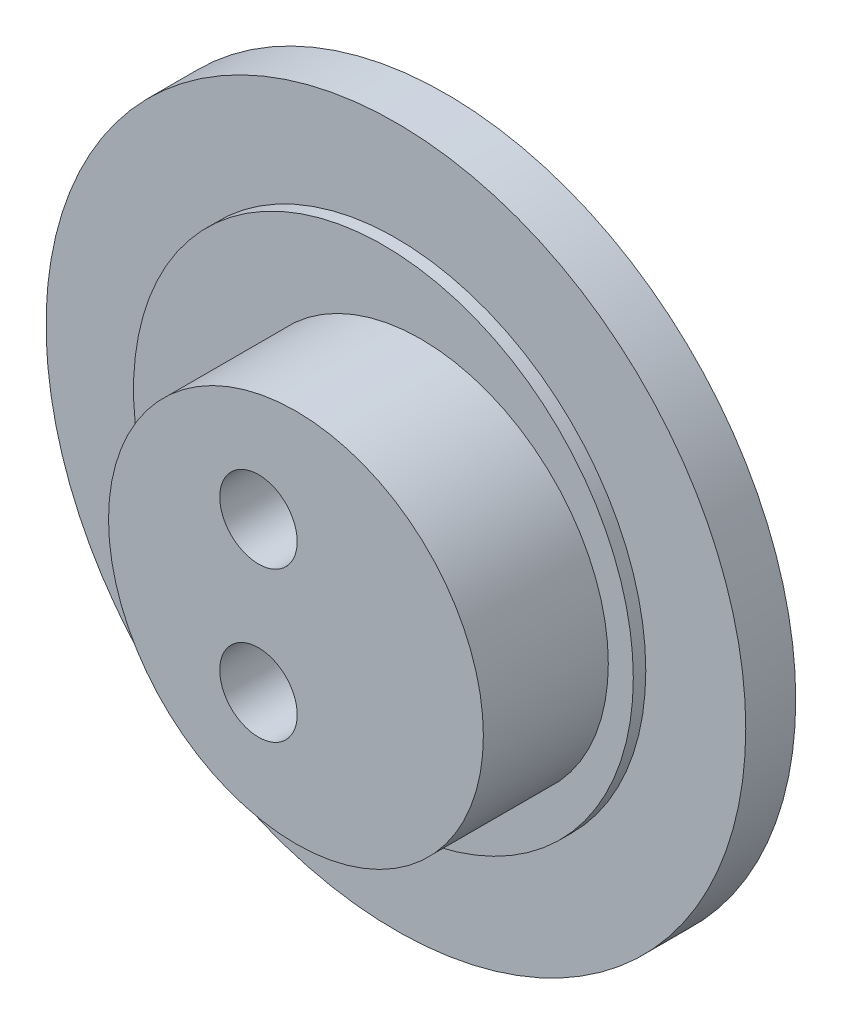
ISO-10303-21;
HEADER;
FILE_DESCRIPTION(('STEP AP214'),'2;1');
FILE_NAME('part.step','',(''),(''),'','','');
FILE_SCHEMA(('AUTOMOTIVE_DESIGN { 1 0 10303 214 1 1 1 1 }'));
ENDSEC;
DATA;
#1=APPLICATION_CONTEXT('core data for automotive mechanical design processes');
#2=APPLICATION_PROTOCOL_DEFINITION('international standard','automotive_design',2000,#1);
#3=PRODUCT_CONTEXT('',#1,'mechanical');
#4=PRODUCT('Part','Part','',(#3));
#5=PRODUCT_RELATED_PRODUCT_CATEGORY('part','',(#4));
#6=PRODUCT_DEFINITION_FORMATION('','',#4);
#7=PRODUCT_DEFINITION_CONTEXT('part definition',#1,'design');
#8=PRODUCT_DEFINITION('design','',#6,#7);
#9=PRODUCT_DEFINITION_SHAPE('','',#8);
#10=(LENGTH_UNIT() NAMED_UNIT(*) SI_UNIT(.MILLI.,.METRE.));
#11=(NAMED_UNIT(*) PLANE_ANGLE_UNIT() SI_UNIT($,.RADIAN.));
#12=(NAMED_UNIT(*) SI_UNIT($,.STERADIAN.) SOLID_ANGLE_UNIT());
#13=UNCERTAINTY_MEASURE_WITH_UNIT(LENGTH_MEASURE(1.E-05),#10,'distance_accuracy_value','');
#14=(GEOMETRIC_REPRESENTATION_CONTEXT(3) GLOBAL_UNCERTAINTY_ASSIGNED_CONTEXT((#13)) GLOBAL_UNIT_ASSIGNED_CONTEXT((#10,
#11,#12)) REPRESENTATION_CONTEXT('',''));
#15=CARTESIAN_POINT('',(0.,0.,0.));
#16=DIRECTION('',(0.,0.,1.));
#17=DIRECTION('',(1.,0.,0.));
#18=AXIS2_PLACEMENT_3D('',#15,#16,#17);
#19=CARTESIAN_POINT('',(0.,0.,0.5));
#20=DIRECTION('',(0.,0.,-1.));
#21=DIRECTION('',(-1.,0.,0.));
#22=AXIS2_PLACEMENT_3D('',#19,#20,#21);
#23=CYLINDRICAL_SURFACE('',#22,10.);
#24=CARTESIAN_POINT('',(0.,0.,0.5));
#25=DIRECTION('',(0.,0.,1.));
#26=DIRECTION('',(1.,0.,0.));
#27=AXIS2_PLACEMENT_3D('',#24,#25,#26);
#28=CIRCLE('',#27,10.);
#29=CARTESIAN_POINT('',(10.,0.,0.5));
#30=VERTEX_POINT('',#29);
#31=EDGE_CURVE('E51',#30,#30,#28,.T.);
#32=ORIENTED_EDGE('',*,*,#31,.F.);
#33=EDGE_LOOP('',(#32));
#34=FACE_BOUND('',#33,.T.);
#35=CARTESIAN_POINT('',(0.,0.,0.));
#36=DIRECTION('',(0.,0.,1.));
#37=DIRECTION('',(1.,0.,0.));
#38=AXIS2_PLACEMENT_3D('',#35,#36,#37);
#39=CIRCLE('',#38,10.);
#40=CARTESIAN_POINT('',(10.,0.,0.));
#41=VERTEX_POINT('',#40);
#42=EDGE_CURVE('E40',#41,#41,#39,.T.);
#43=ORIENTED_EDGE('',*,*,#42,.T.);
#44=EDGE_LOOP('',(#43));
#45=FACE_BOUND('',#44,.T.);
#46=ADVANCED_FACE('F37',(#34,#45),#23,.T.);
#47=CARTESIAN_POINT('',(0.,0.,0.));
#48=DIRECTION('',(0.,0.,1.));
#49=DIRECTION('',(1.,0.,0.));
#50=AXIS2_PLACEMENT_3D('',#47,#48,#49);
#51=PLANE('',#50);
#52=CARTESIAN_POINT('',(0.,3.,0.));
#53=DIRECTION('',(0.,0.,1.));
#54=DIRECTION('',(1.,0.,0.));
#55=AXIS2_PLACEMENT_3D('',#52,#53,#54);
#56=CIRCLE('',#55,1.55);
#57=CARTESIAN_POINT('',(1.55,3.,0.));
#58=VERTEX_POINT('',#57);
#59=EDGE_CURVE('E125',#58,#58,#56,.T.);
#60=ORIENTED_EDGE('',*,*,#59,.T.);
#61=EDGE_LOOP('',(#60));
#62=FACE_BOUND('',#61,.T.);
#63=CARTESIAN_POINT('',(0.,-3.,0.));
#64=DIRECTION('',(0.,0.,1.));
#65=DIRECTION('',(-1.,0.,0.));
#66=AXIS2_PLACEMENT_3D('',#63,#64,#65);
#67=CIRCLE('',#66,1.55);
#68=CARTESIAN_POINT('',(-1.55,-3.,0.));
#69=VERTEX_POINT('',#68);
#70=EDGE_CURVE('E130',#69,#69,#67,.T.);
#71=ORIENTED_EDGE('',*,*,#70,.T.);
#72=EDGE_LOOP('',(#71));
#73=FACE_BOUND('',#72,.T.);
#74=ORIENTED_EDGE('',*,*,#42,.F.);
#75=EDGE_LOOP('',(#74));
#76=FACE_BOUND('',#75,.T.);
#77=ADVANCED_FACE('F77',(#62,#73,#76),#51,.F.);
#78=CARTESIAN_POINT('',(0.,0.,2.5));
#79=DIRECTION('',(0.,0.,-1.));
#80=DIRECTION('',(-1.,0.,0.));
#81=AXIS2_PLACEMENT_3D('',#78,#79,#80);
#82=CYLINDRICAL_SURFACE('',#81,14.);
#83=CARTESIAN_POINT('',(0.,0.,2.5));
#84=DIRECTION('',(0.,0.,1.));
#85=DIRECTION('',(1.,0.,0.));
#86=AXIS2_PLACEMENT_3D('',#83,#84,#85);
#87=CIRCLE('',#86,14.);
#88=CARTESIAN_POINT('',(14.,0.,2.5));
#89=VERTEX_POINT('',#88);
#90=EDGE_CURVE('E62',#89,#89,#87,.T.);
#91=ORIENTED_EDGE('',*,*,#90,.F.);
#92=EDGE_LOOP('',(#91));
#93=FACE_BOUND('',#92,.T.);
#94=CARTESIAN_POINT('',(0.,0.,0.5));
#95=DIRECTION('',(0.,0.,1.));
#96=DIRECTION('',(1.,0.,0.));
#97=AXIS2_PLACEMENT_3D('',#94,#95,#96);
#98=CIRCLE('',#97,14.);
#99=CARTESIAN_POINT('',(14.,0.,0.5));
#100=VERTEX_POINT('',#99);
#101=EDGE_CURVE('E60',#100,#100,#98,.T.);
#102=ORIENTED_EDGE('',*,*,#101,.T.);
#103=EDGE_LOOP('',(#102));
#104=FACE_BOUND('',#103,.T.);
#105=ADVANCED_FACE('F79',(#93,#104),#82,.T.);
#106=CARTESIAN_POINT('',(0.,0.,2.5));
#107=DIRECTION('',(0.,0.,1.));
#108=DIRECTION('',(1.,0.,0.));
#109=AXIS2_PLACEMENT_3D('',#106,#107,#108);
#110=PLANE('',#109);
#111=CARTESIAN_POINT('',(0.,0.,2.5));
#112=DIRECTION('',(0.,0.,1.));
#113=DIRECTION('',(1.,0.,0.));
#114=AXIS2_PLACEMENT_3D('',#111,#112,#113);
#115=CIRCLE('',#114,10.);
#116=CARTESIAN_POINT('',(10.,0.,2.5));
#117=VERTEX_POINT('',#116);
#118=EDGE_CURVE('E45',#117,#117,#115,.T.);
#119=ORIENTED_EDGE('',*,*,#118,.F.);
#120=EDGE_LOOP('',(#119));
#121=FACE_BOUND('',#120,.T.);
#122=ORIENTED_EDGE('',*,*,#90,.T.);
#123=EDGE_LOOP('',(#122));
#124=FACE_BOUND('',#123,.T.);
#125=ADVANCED_FACE('F85',(#121,#124),#110,.T.);
#126=CARTESIAN_POINT('',(0.,0.,0.5));
#127=DIRECTION('',(0.,0.,1.));
#128=DIRECTION('',(1.,0.,0.));
#129=AXIS2_PLACEMENT_3D('',#126,#127,#128);
#130=PLANE('',#129);
#131=ORIENTED_EDGE('',*,*,#31,.T.);
#132=EDGE_LOOP('',(#131));
#133=FACE_BOUND('',#132,.T.);
#134=ORIENTED_EDGE('',*,*,#101,.F.);
#135=EDGE_LOOP('',(#134));
#136=FACE_BOUND('',#135,.T.);
#137=ADVANCED_FACE('F92',(#133,#136),#130,.F.);
#138=CARTESIAN_POINT('',(0.,0.,3.));
#139=DIRECTION('',(0.,0.,-1.));
#140=DIRECTION('',(-1.,0.,0.));
#141=AXIS2_PLACEMENT_3D('',#138,#139,#140);
#142=CYLINDRICAL_SURFACE('',#141,10.);
#143=CARTESIAN_POINT('',(0.,0.,3.));
#144=DIRECTION('',(0.,0.,1.));
#145=DIRECTION('',(1.,0.,0.));
#146=AXIS2_PLACEMENT_3D('',#143,#144,#145);
#147=CIRCLE('',#146,10.);
#148=CARTESIAN_POINT('',(10.,0.,3.));
#149=VERTEX_POINT('',#148);
#150=EDGE_CURVE('E57',#149,#149,#147,.T.);
#151=ORIENTED_EDGE('',*,*,#150,.F.);
#152=EDGE_LOOP('',(#151));
#153=FACE_BOUND('',#152,.T.);
#154=ORIENTED_EDGE('',*,*,#118,.T.);
#155=EDGE_LOOP('',(#154));
#156=FACE_BOUND('',#155,.T.);
#157=ADVANCED_FACE('F95',(#153,#156),#142,.T.);
#158=CARTESIAN_POINT('',(0.,0.,3.));
#159=DIRECTION('',(0.,0.,1.));
#160=DIRECTION('',(1.,0.,0.));
#161=AXIS2_PLACEMENT_3D('',#158,#159,#160);
#162=PLANE('',#161);
#163=CARTESIAN_POINT('',(1.5,0.,3.));
#164=DIRECTION('',(0.,0.,1.));
#165=DIRECTION('',(1.,0.,0.));
#166=AXIS2_PLACEMENT_3D('',#163,#164,#165);
#167=CIRCLE('',#166,7.5);
#168=CARTESIAN_POINT('',(9.,0.,3.));
#169=VERTEX_POINT('',#168);
#170=EDGE_CURVE('E10',#169,#169,#167,.T.);
#171=ORIENTED_EDGE('',*,*,#170,.F.);
#172=EDGE_LOOP('',(#171));
#173=FACE_BOUND('',#172,.T.);
#174=ORIENTED_EDGE('',*,*,#150,.T.);
#175=EDGE_LOOP('',(#174));
#176=FACE_BOUND('',#175,.T.);
#177=ADVANCED_FACE('F101',(#173,#176),#162,.T.);
#178=CARTESIAN_POINT('',(1.5,0.,8.));
#179=DIRECTION('',(0.,0.,-1.));
#180=DIRECTION('',(-1.,0.,0.));
#181=AXIS2_PLACEMENT_3D('',#178,#179,#180);
#182=CYLINDRICAL_SURFACE('',#181,7.5);
#183=CARTESIAN_POINT('',(1.5,0.,8.));
#184=DIRECTION('',(0.,0.,1.));
#185=DIRECTION('',(1.,0.,0.));
#186=AXIS2_PLACEMENT_3D('',#183,#184,#185);
#187=CIRCLE('',#186,7.5);
#188=CARTESIAN_POINT('',(9.,0.,8.));
#189=VERTEX_POINT('',#188);
#190=EDGE_CURVE('E55',#189,#189,#187,.T.);
#191=ORIENTED_EDGE('',*,*,#190,.F.);
#192=EDGE_LOOP('',(#191));
#193=FACE_BOUND('',#192,.T.);
#194=ORIENTED_EDGE('',*,*,#170,.T.);
#195=EDGE_LOOP('',(#194));
#196=FACE_BOUND('',#195,.T.);
#197=ADVANCED_FACE('F105',(#193,#196),#182,.T.);
#198=CARTESIAN_POINT('',(1.5,0.,8.));
#199=DIRECTION('',(0.,0.,1.));
#200=DIRECTION('',(1.,0.,0.));
#201=AXIS2_PLACEMENT_3D('',#198,#199,#200);
#202=PLANE('',#201);
#203=CARTESIAN_POINT('',(0.,3.,8.));
#204=DIRECTION('',(0.,0.,1.));
#205=DIRECTION('',(1.,0.,0.));
#206=AXIS2_PLACEMENT_3D('',#203,#204,#205);
#207=CIRCLE('',#206,1.55);
#208=CARTESIAN_POINT('',(1.55,3.,8.));
#209=VERTEX_POINT('',#208);
#210=EDGE_CURVE('E128',#209,#209,#207,.T.);
#211=ORIENTED_EDGE('',*,*,#210,.F.);
#212=EDGE_LOOP('',(#211));
#213=FACE_BOUND('',#212,.T.);
#214=CARTESIAN_POINT('',(0.,-3.,8.));
#215=DIRECTION('',(0.,0.,1.));
#216=DIRECTION('',(-1.,0.,0.));
#217=AXIS2_PLACEMENT_3D('',#214,#215,#216);
#218=CIRCLE('',#217,1.55);
#219=CARTESIAN_POINT('',(-1.55,-3.,8.));
#220=VERTEX_POINT('',#219);
#221=EDGE_CURVE('E136',#220,#220,#218,.T.);
#222=ORIENTED_EDGE('',*,*,#221,.F.);
#223=EDGE_LOOP('',(#222));
#224=FACE_BOUND('',#223,.T.);
#225=ORIENTED_EDGE('',*,*,#190,.T.);
#226=EDGE_LOOP('',(#225));
#227=FACE_BOUND('',#226,.T.);
#228=ADVANCED_FACE('F109',(#213,#224,#227),#202,.T.);
#229=CARTESIAN_POINT('',(0.,-3.,0.));
#230=DIRECTION('',(0.,0.,1.));
#231=DIRECTION('',(1.,0.,0.));
#232=AXIS2_PLACEMENT_3D('',#229,#230,#231);
#233=CYLINDRICAL_SURFACE('',#232,1.55);
#234=ORIENTED_EDGE('',*,*,#70,.F.);
#235=EDGE_LOOP('',(#234));
#236=FACE_BOUND('',#235,.T.);
#237=ORIENTED_EDGE('',*,*,#221,.T.);
#238=EDGE_LOOP('',(#237));
#239=FACE_BOUND('',#238,.T.);
#240=ADVANCED_FACE('F113',(#236,#239),#233,.F.);
#241=CARTESIAN_POINT('',(0.,3.,0.));
#242=DIRECTION('',(0.,0.,1.));
#243=DIRECTION('',(1.,0.,0.));
#244=AXIS2_PLACEMENT_3D('',#241,#242,#243);
#245=CYLINDRICAL_SURFACE('',#244,1.55);
#246=ORIENTED_EDGE('',*,*,#59,.F.);
#247=EDGE_LOOP('',(#246));
#248=FACE_BOUND('',#247,.T.);
#249=ORIENTED_EDGE('',*,*,#210,.T.);
#250=EDGE_LOOP('',(#249));
#251=FACE_BOUND('',#250,.T.);
#252=ADVANCED_FACE('F117',(#248,#251),#245,.F.);
#253=CLOSED_SHELL('',(#46,#77,#105,#125,#137,#157,#177,#197,#228,#240,#252));
#254=MANIFOLD_SOLID_BREP('B2',#253);
#255=ADVANCED_BREP_SHAPE_REPRESENTATION('',(#18,#254),#14);
#256=SHAPE_DEFINITION_REPRESENTATION(#9,#255);
ENDSEC;
END-ISO-10303-21;
